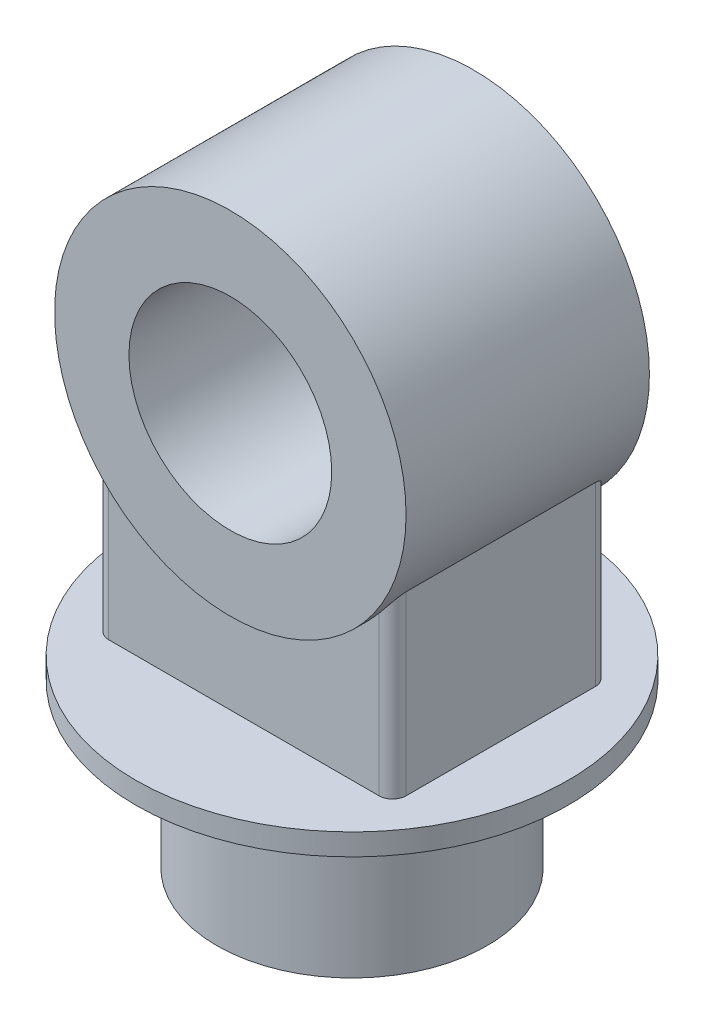
ISO-10303-21;
HEADER;
FILE_DESCRIPTION(('STEP AP214'),'2;1');
FILE_NAME('part.step','',(''),(''),'','','');
FILE_SCHEMA(('AUTOMOTIVE_DESIGN { 1 0 10303 214 1 1 1 1 }'));
ENDSEC;
DATA;
#1=APPLICATION_CONTEXT('core data for automotive mechanical design processes');
#2=APPLICATION_PROTOCOL_DEFINITION('international standard','automotive_design',2000,#1);
#3=PRODUCT_CONTEXT('',#1,'mechanical');
#4=PRODUCT('Part','Part','',(#3));
#5=PRODUCT_RELATED_PRODUCT_CATEGORY('part','',(#4));
#6=PRODUCT_DEFINITION_FORMATION('','',#4);
#7=PRODUCT_DEFINITION_CONTEXT('part definition',#1,'design');
#8=PRODUCT_DEFINITION('design','',#6,#7);
#9=PRODUCT_DEFINITION_SHAPE('','',#8);
#10=(LENGTH_UNIT() NAMED_UNIT(*) SI_UNIT(.MILLI.,.METRE.));
#11=(NAMED_UNIT(*) PLANE_ANGLE_UNIT() SI_UNIT($,.RADIAN.));
#12=(NAMED_UNIT(*) SI_UNIT($,.STERADIAN.) SOLID_ANGLE_UNIT());
#13=UNCERTAINTY_MEASURE_WITH_UNIT(LENGTH_MEASURE(1.E-05),#10,'distance_accuracy_value','');
#14=(GEOMETRIC_REPRESENTATION_CONTEXT(3) GLOBAL_UNCERTAINTY_ASSIGNED_CONTEXT((#13)) GLOBAL_UNIT_ASSIGNED_CONTEXT((#10,
#11,#12)) REPRESENTATION_CONTEXT('',''));
#15=CARTESIAN_POINT('',(0.,0.,0.));
#16=DIRECTION('',(0.,0.,1.));
#17=DIRECTION('',(1.,0.,0.));
#18=AXIS2_PLACEMENT_3D('',#15,#16,#17);
#19=CARTESIAN_POINT('',(0.,120.,0.));
#20=DIRECTION('',(0.,-1.,0.));
#21=DIRECTION('',(0.,0.,-1.));
#22=AXIS2_PLACEMENT_3D('',#19,#20,#21);
#23=CYLINDRICAL_SURFACE('',#22,100.);
#24=CARTESIAN_POINT('',(0.,120.,0.));
#25=DIRECTION('',(0.,1.,0.));
#26=DIRECTION('',(0.,0.,1.));
#27=AXIS2_PLACEMENT_3D('',#24,#25,#26);
#28=CIRCLE('',#27,100.);
#29=CARTESIAN_POINT('',(0.,120.,100.));
#30=VERTEX_POINT('',#29);
#31=EDGE_CURVE('E144',#30,#30,#28,.T.);
#32=ORIENTED_EDGE('',*,*,#31,.F.);
#33=EDGE_LOOP('',(#32));
#34=FACE_BOUND('',#33,.T.);
#35=CARTESIAN_POINT('',(0.,0.,0.));
#36=DIRECTION('',(0.,1.,0.));
#37=DIRECTION('',(0.,0.,1.));
#38=AXIS2_PLACEMENT_3D('',#35,#36,#37);
#39=CIRCLE('',#38,100.);
#40=CARTESIAN_POINT('',(0.,0.,100.));
#41=VERTEX_POINT('',#40);
#42=EDGE_CURVE('E218',#41,#41,#39,.T.);
#43=ORIENTED_EDGE('',*,*,#42,.T.);
#44=EDGE_LOOP('',(#43));
#45=FACE_BOUND('',#44,.T.);
#46=ADVANCED_FACE('F43',(#34,#45),#23,.T.);
#47=CARTESIAN_POINT('',(0.,0.,0.));
#48=DIRECTION('',(0.,1.,0.));
#49=DIRECTION('',(0.,0.,1.));
#50=AXIS2_PLACEMENT_3D('',#47,#48,#49);
#51=PLANE('',#50);
#52=ORIENTED_EDGE('',*,*,#42,.F.);
#53=EDGE_LOOP('',(#52));
#54=FACE_BOUND('',#53,.T.);
#55=ADVANCED_FACE('F206',(#54),#51,.F.);
#56=CARTESIAN_POINT('',(0.,136.,0.));
#57=DIRECTION('',(0.,-1.,0.));
#58=DIRECTION('',(0.,0.,-1.));
#59=AXIS2_PLACEMENT_3D('',#56,#57,#58);
#60=CYLINDRICAL_SURFACE('',#59,160.);
#61=CARTESIAN_POINT('',(0.,136.,0.));
#62=DIRECTION('',(0.,1.,0.));
#63=DIRECTION('',(0.,0.,1.));
#64=AXIS2_PLACEMENT_3D('',#61,#62,#63);
#65=CIRCLE('',#64,160.);
#66=CARTESIAN_POINT('',(0.,136.,160.));
#67=VERTEX_POINT('',#66);
#68=EDGE_CURVE('E219',#67,#67,#65,.T.);
#69=ORIENTED_EDGE('',*,*,#68,.F.);
#70=EDGE_LOOP('',(#69));
#71=FACE_BOUND('',#70,.T.);
#72=CARTESIAN_POINT('',(0.,120.,0.));
#73=DIRECTION('',(0.,1.,0.));
#74=DIRECTION('',(0.,0.,1.));
#75=AXIS2_PLACEMENT_3D('',#72,#73,#74);
#76=CIRCLE('',#75,160.);
#77=CARTESIAN_POINT('',(0.,120.,160.));
#78=VERTEX_POINT('',#77);
#79=EDGE_CURVE('E222',#78,#78,#76,.T.);
#80=ORIENTED_EDGE('',*,*,#79,.T.);
#81=EDGE_LOOP('',(#80));
#82=FACE_BOUND('',#81,.T.);
#83=ADVANCED_FACE('F211',(#71,#82),#60,.T.);
#84=CARTESIAN_POINT('',(0.,136.,0.));
#85=DIRECTION('',(0.,1.,0.));
#86=DIRECTION('',(0.,0.,1.));
#87=AXIS2_PLACEMENT_3D('',#84,#85,#86);
#88=PLANE('',#87);
#89=DIRECTION('',(0.,0.,-1.));
#90=VECTOR('',#89,1.);
#91=CARTESIAN_POINT('',(110.,136.,80.));
#92=LINE('',#91,#90);
#93=CARTESIAN_POINT('',(110.,136.,70.));
#94=VERTEX_POINT('',#93);
#95=CARTESIAN_POINT('',(110.,136.,-70.));
#96=VERTEX_POINT('',#95);
#97=EDGE_CURVE('E226',#94,#96,#92,.T.);
#98=ORIENTED_EDGE('',*,*,#97,.F.);
#99=CARTESIAN_POINT('',(100.,136.,70.));
#100=DIRECTION('',(0.,1.,0.));
#101=DIRECTION('',(0.,0.,1.));
#102=AXIS2_PLACEMENT_3D('',#99,#100,#101);
#103=CIRCLE('',#102,10.);
#104=CARTESIAN_POINT('',(100.,136.,80.));
#105=VERTEX_POINT('',#104);
#106=EDGE_CURVE('E126',#94,#105,#103,.F.);
#107=ORIENTED_EDGE('',*,*,#106,.T.);
#108=DIRECTION('',(1.,0.,0.));
#109=VECTOR('',#108,1.);
#110=CARTESIAN_POINT('',(-110.,136.,80.));
#111=LINE('',#110,#109);
#112=CARTESIAN_POINT('',(-100.,136.,80.));
#113=VERTEX_POINT('',#112);
#114=EDGE_CURVE('E231',#113,#105,#111,.T.);
#115=ORIENTED_EDGE('',*,*,#114,.F.);
#116=CARTESIAN_POINT('',(-100.,136.,70.));
#117=DIRECTION('',(0.,1.,0.));
#118=DIRECTION('',(0.,0.,1.));
#119=AXIS2_PLACEMENT_3D('',#116,#117,#118);
#120=CIRCLE('',#119,10.);
#121=CARTESIAN_POINT('',(-110.,136.,70.));
#122=VERTEX_POINT('',#121);
#123=EDGE_CURVE('E57',#113,#122,#120,.F.);
#124=ORIENTED_EDGE('',*,*,#123,.T.);
#125=DIRECTION('',(0.,0.,1.));
#126=VECTOR('',#125,1.);
#127=CARTESIAN_POINT('',(-110.,136.,80.));
#128=LINE('',#127,#126);
#129=CARTESIAN_POINT('',(-110.,136.,-70.));
#130=VERTEX_POINT('',#129);
#131=EDGE_CURVE('E234',#130,#122,#128,.T.);
#132=ORIENTED_EDGE('',*,*,#131,.F.);
#133=CARTESIAN_POINT('',(-100.,136.,-70.));
#134=DIRECTION('',(0.,1.,0.));
#135=DIRECTION('',(0.,0.,1.));
#136=AXIS2_PLACEMENT_3D('',#133,#134,#135);
#137=CIRCLE('',#136,10.);
#138=CARTESIAN_POINT('',(-100.,136.,-80.));
#139=VERTEX_POINT('',#138);
#140=EDGE_CURVE('E71',#130,#139,#137,.F.);
#141=ORIENTED_EDGE('',*,*,#140,.T.);
#142=DIRECTION('',(-1.,0.,0.));
#143=VECTOR('',#142,1.);
#144=CARTESIAN_POINT('',(-110.,136.,-80.));
#145=LINE('',#144,#143);
#146=CARTESIAN_POINT('',(100.,136.,-80.));
#147=VERTEX_POINT('',#146);
#148=EDGE_CURVE('E237',#147,#139,#145,.T.);
#149=ORIENTED_EDGE('',*,*,#148,.F.);
#150=CARTESIAN_POINT('',(100.,136.,-70.));
#151=DIRECTION('',(0.,1.,0.));
#152=DIRECTION('',(0.,0.,1.));
#153=AXIS2_PLACEMENT_3D('',#150,#151,#152);
#154=CIRCLE('',#153,10.);
#155=EDGE_CURVE('E127',#147,#96,#154,.F.);
#156=ORIENTED_EDGE('',*,*,#155,.T.);
#157=EDGE_LOOP('',(#98,#107,#115,#124,#132,#141,#149,#156));
#158=FACE_BOUND('',#157,.T.);
#159=ORIENTED_EDGE('',*,*,#68,.T.);
#160=EDGE_LOOP('',(#159));
#161=FACE_BOUND('',#160,.T.);
#162=ADVANCED_FACE('F277',(#158,#161),#88,.T.);
#163=CARTESIAN_POINT('',(0.,120.,0.));
#164=DIRECTION('',(0.,1.,0.));
#165=DIRECTION('',(0.,0.,1.));
#166=AXIS2_PLACEMENT_3D('',#163,#164,#165);
#167=PLANE('',#166);
#168=ORIENTED_EDGE('',*,*,#31,.T.);
#169=EDGE_LOOP('',(#168));
#170=FACE_BOUND('',#169,.T.);
#171=ORIENTED_EDGE('',*,*,#79,.F.);
#172=EDGE_LOOP('',(#171));
#173=FACE_BOUND('',#172,.T.);
#174=ADVANCED_FACE('F281',(#170,#173),#167,.F.);
#175=CARTESIAN_POINT('',(-110.,466.002,-80.));
#176=DIRECTION('',(0.,0.,1.));
#177=DIRECTION('',(1.,0.,0.));
#178=AXIS2_PLACEMENT_3D('',#175,#176,#177);
#179=PLANE('',#178);
#180=CARTESIAN_POINT('',(0.,336.,-80.));
#181=DIRECTION('',(0.,0.,1.));
#182=DIRECTION('',(1.,0.,0.));
#183=AXIS2_PLACEMENT_3D('',#180,#181,#182);
#184=CIRCLE('',#183,130.);
#185=CARTESIAN_POINT('',(100.,252.933761370819,-80.));
#186=VERTEX_POINT('',#185);
#187=CARTESIAN_POINT('',(-100.,252.933761370819,-80.));
#188=VERTEX_POINT('',#187);
#189=EDGE_CURVE('E119',#186,#188,#184,.F.);
#190=ORIENTED_EDGE('',*,*,#189,.F.);
#191=DIRECTION('',(0.,-1.,0.));
#192=VECTOR('',#191,1.);
#193=CARTESIAN_POINT('',(100.,466.002,-80.));
#194=LINE('',#193,#192);
#195=EDGE_CURVE('E133',#186,#147,#194,.T.);
#196=ORIENTED_EDGE('',*,*,#195,.T.);
#197=ORIENTED_EDGE('',*,*,#148,.T.);
#198=DIRECTION('',(0.,-1.,0.));
#199=VECTOR('',#198,1.);
#200=CARTESIAN_POINT('',(-100.,466.002,-80.));
#201=LINE('',#200,#199);
#202=EDGE_CURVE('E135',#139,#188,#201,.F.);
#203=ORIENTED_EDGE('',*,*,#202,.T.);
#204=EDGE_LOOP('',(#190,#196,#197,#203));
#205=FACE_BOUND('',#204,.T.);
#206=ADVANCED_FACE('F131',(#205),#179,.F.);
#207=CARTESIAN_POINT('',(110.,466.002,80.));
#208=DIRECTION('',(-1.,0.,0.));
#209=DIRECTION('',(0.,0.,1.));
#210=AXIS2_PLACEMENT_3D('',#207,#208,#209);
#211=PLANE('',#210);
#212=ORIENTED_EDGE('',*,*,#97,.T.);
#213=DIRECTION('',(0.,-1.,0.));
#214=VECTOR('',#213,1.);
#215=CARTESIAN_POINT('',(110.,466.002,-70.));
#216=LINE('',#215,#214);
#217=CARTESIAN_POINT('',(110.,266.717967697245,-70.));
#218=VERTEX_POINT('',#217);
#219=EDGE_CURVE('E142',#96,#218,#216,.F.);
#220=ORIENTED_EDGE('',*,*,#219,.T.);
#221=DIRECTION('',(0.,0.,-1.));
#222=VECTOR('',#221,1.);
#223=CARTESIAN_POINT('',(110.,266.717967697245,90.));
#224=LINE('',#223,#222);
#225=CARTESIAN_POINT('',(110.,266.717967697245,70.));
#226=VERTEX_POINT('',#225);
#227=EDGE_CURVE('E122',#226,#218,#224,.T.);
#228=ORIENTED_EDGE('',*,*,#227,.F.);
#229=DIRECTION('',(0.,-1.,0.));
#230=VECTOR('',#229,1.);
#231=CARTESIAN_POINT('',(110.,466.002,70.));
#232=LINE('',#231,#230);
#233=EDGE_CURVE('E139',#226,#94,#232,.T.);
#234=ORIENTED_EDGE('',*,*,#233,.T.);
#235=EDGE_LOOP('',(#212,#220,#228,#234));
#236=FACE_BOUND('',#235,.T.);
#237=ADVANCED_FACE('F289',(#236),#211,.F.);
#238=CARTESIAN_POINT('',(-110.,466.002,80.));
#239=DIRECTION('',(1.,0.,0.));
#240=DIRECTION('',(0.,0.,-1.));
#241=AXIS2_PLACEMENT_3D('',#238,#239,#240);
#242=PLANE('',#241);
#243=DIRECTION('',(0.,0.,-1.));
#244=VECTOR('',#243,1.);
#245=CARTESIAN_POINT('',(-110.,266.717967697245,90.));
#246=LINE('',#245,#244);
#247=CARTESIAN_POINT('',(-110.,266.717967697245,-70.));
#248=VERTEX_POINT('',#247);
#249=CARTESIAN_POINT('',(-110.,266.717967697245,70.));
#250=VERTEX_POINT('',#249);
#251=EDGE_CURVE('E136',#248,#250,#246,.F.);
#252=ORIENTED_EDGE('',*,*,#251,.F.);
#253=DIRECTION('',(0.,-1.,0.));
#254=VECTOR('',#253,1.);
#255=CARTESIAN_POINT('',(-110.,466.002,-70.));
#256=LINE('',#255,#254);
#257=EDGE_CURVE('E156',#248,#130,#256,.T.);
#258=ORIENTED_EDGE('',*,*,#257,.T.);
#259=ORIENTED_EDGE('',*,*,#131,.T.);
#260=DIRECTION('',(0.,-1.,0.));
#261=VECTOR('',#260,1.);
#262=CARTESIAN_POINT('',(-110.,466.002,70.));
#263=LINE('',#262,#261);
#264=EDGE_CURVE('E154',#122,#250,#263,.F.);
#265=ORIENTED_EDGE('',*,*,#264,.T.);
#266=EDGE_LOOP('',(#252,#258,#259,#265));
#267=FACE_BOUND('',#266,.T.);
#268=ADVANCED_FACE('F196',(#267),#242,.F.);
#269=CARTESIAN_POINT('',(-110.,466.002,80.));
#270=DIRECTION('',(0.,0.,-1.));
#271=DIRECTION('',(-1.,0.,0.));
#272=AXIS2_PLACEMENT_3D('',#269,#270,#271);
#273=PLANE('',#272);
#274=ORIENTED_EDGE('',*,*,#114,.T.);
#275=DIRECTION('',(0.,-1.,0.));
#276=VECTOR('',#275,1.);
#277=CARTESIAN_POINT('',(100.,466.002,80.));
#278=LINE('',#277,#276);
#279=CARTESIAN_POINT('',(100.,252.933761370819,80.));
#280=VERTEX_POINT('',#279);
#281=EDGE_CURVE('E152',#105,#280,#278,.F.);
#282=ORIENTED_EDGE('',*,*,#281,.T.);
#283=CARTESIAN_POINT('',(0.,336.,80.));
#284=DIRECTION('',(0.,0.,-1.));
#285=DIRECTION('',(-1.,0.,0.));
#286=AXIS2_PLACEMENT_3D('',#283,#284,#285);
#287=CIRCLE('',#286,130.);
#288=CARTESIAN_POINT('',(-100.,252.933761370819,80.));
#289=VERTEX_POINT('',#288);
#290=EDGE_CURVE('E198',#289,#280,#287,.F.);
#291=ORIENTED_EDGE('',*,*,#290,.F.);
#292=DIRECTION('',(0.,-1.,0.));
#293=VECTOR('',#292,1.);
#294=CARTESIAN_POINT('',(-100.,466.002,80.));
#295=LINE('',#294,#293);
#296=EDGE_CURVE('E149',#289,#113,#295,.T.);
#297=ORIENTED_EDGE('',*,*,#296,.T.);
#298=EDGE_LOOP('',(#274,#282,#291,#297));
#299=FACE_BOUND('',#298,.T.);
#300=ADVANCED_FACE('F265',(#299),#273,.F.);
#301=CARTESIAN_POINT('',(0.,336.,90.));
#302=DIRECTION('',(0.,0.,-1.));
#303=DIRECTION('',(-1.,0.,0.));
#304=AXIS2_PLACEMENT_3D('',#301,#302,#303);
#305=CYLINDRICAL_SURFACE('',#304,130.);
#306=CARTESIAN_POINT('',(0.,336.,90.));
#307=DIRECTION('',(0.,0.,1.));
#308=DIRECTION('',(1.,0.,0.));
#309=AXIS2_PLACEMENT_3D('',#306,#307,#308);
#310=CIRCLE('',#309,130.);
#311=CARTESIAN_POINT('',(130.,336.,90.));
#312=VERTEX_POINT('',#311);
#313=EDGE_CURVE('E228',#312,#312,#310,.T.);
#314=ORIENTED_EDGE('',*,*,#313,.F.);
#315=EDGE_LOOP('',(#314));
#316=FACE_BOUND('',#315,.T.);
#317=CARTESIAN_POINT('',(0.,336.,-90.));
#318=DIRECTION('',(0.,0.,1.));
#319=DIRECTION('',(1.,0.,0.));
#320=AXIS2_PLACEMENT_3D('',#317,#318,#319);
#321=CIRCLE('',#320,130.);
#322=CARTESIAN_POINT('',(130.,336.,-90.));
#323=VERTEX_POINT('',#322);
#324=EDGE_CURVE('E240',#323,#323,#321,.T.);
#325=ORIENTED_EDGE('',*,*,#324,.T.);
#326=EDGE_LOOP('',(#325));
#327=FACE_BOUND('',#326,.T.);
#328=ORIENTED_EDGE('',*,*,#290,.T.);
#329=CARTESIAN_POINT('',(100.,252.933761370819,80.));
#330=CARTESIAN_POINT('',(100.223611151915,253.202952503255,79.9999830665315));
#331=CARTESIAN_POINT('',(100.446118360057,253.473036166024,79.9924995885085));
#332=CARTESIAN_POINT('',(100.888548742496,254.014496760122,79.9629173131463));
#333=CARTESIAN_POINT('',(101.108472043759,254.285873626978,79.9408192370116));
#334=CARTESIAN_POINT('',(101.545586290072,254.829711400373,79.8822979337703));
#335=CARTESIAN_POINT('',(101.76277446753,255.102173087004,79.8458612385231));
#336=CARTESIAN_POINT('',(102.193849033468,255.647413797012,79.7588609087488));
#337=CARTESIAN_POINT('',(102.407735374993,255.920192824843,79.7082970735217));
#338=CARTESIAN_POINT('',(103.048408055095,256.74400885936,79.5343891784366));
#339=CARTESIAN_POINT('',(103.469748368072,257.294974230618,79.3894263280958));
#340=CARTESIAN_POINT('',(104.088382224678,258.117224843771,79.1288060997197));
#341=CARTESIAN_POINT('',(104.292337034927,258.39057162742,79.0347525474725));
#342=CARTESIAN_POINT('',(104.695498702643,258.935304765081,78.8319429710982));
#343=CARTESIAN_POINT('',(104.894706004332,259.206691300842,78.7231883289499));
#344=CARTESIAN_POINT('',(105.336170271764,259.812965668139,78.4620472638272));
#345=CARTESIAN_POINT('',(105.577006541077,260.147108038148,78.3055009036513));
#346=CARTESIAN_POINT('',(106.04966094987,260.809343252621,77.967808626391));
#347=CARTESIAN_POINT('',(106.281479043935,261.137436066616,77.7866625854444));
#348=CARTESIAN_POINT('',(106.734152264033,261.784259610706,77.3986376161628));
#349=CARTESIAN_POINT('',(106.955036134368,262.103013877598,77.1918317878757));
#350=CARTESIAN_POINT('',(107.384708325122,262.728803605627,76.749894392022));
#351=CARTESIAN_POINT('',(107.593501627276,263.035843875289,76.5147746155492));
#352=CARTESIAN_POINT('',(107.921279015409,263.522080966666,76.1068757916445));
#353=CARTESIAN_POINT('',(108.044709884718,263.706240813682,75.9435605188263));
#354=CARTESIAN_POINT('',(108.284949666933,264.066582834907,75.6038296157538));
#355=CARTESIAN_POINT('',(108.401760304956,264.242767084986,75.4274174262628));
#356=CARTESIAN_POINT('',(108.627683741988,264.585236991633,75.0605773993746));
#357=CARTESIAN_POINT('',(108.736797961361,264.751524473746,74.8701521613912));
#358=CARTESIAN_POINT('',(108.945874410432,265.071634412635,74.4745306992527));
#359=CARTESIAN_POINT('',(109.04583974995,265.225461102935,74.2693395369045));
#360=CARTESIAN_POINT('',(109.274660386151,265.579056080623,73.7536743100227));
#361=CARTESIAN_POINT('',(109.398046362816,265.771031349643,73.4351396850742));
#362=CARTESIAN_POINT('',(109.561336457207,266.026263049992,72.9345418523035));
#363=CARTESIAN_POINT('',(109.612072269395,266.105785634321,72.7641622498836));
#364=CARTESIAN_POINT('',(109.705421847597,266.25239837099,72.4160328323222));
#365=CARTESIAN_POINT('',(109.748040656091,266.319496241142,72.2382876769632));
#366=CARTESIAN_POINT('',(109.820262744001,266.433384610412,71.8947331689276));
#367=CARTESIAN_POINT('',(109.850752312767,266.481551609067,71.729567610939));
#368=CARTESIAN_POINT('',(109.903691363628,266.565274678987,71.3948451418076));
#369=CARTESIAN_POINT('',(109.926143541964,266.600834979285,71.2252897238033));
#370=CARTESIAN_POINT('',(109.962659042777,266.658707696818,70.8807814271977));
#371=CARTESIAN_POINT('',(109.976613864032,266.680848750137,70.7057875562757));
#372=CARTESIAN_POINT('',(109.99061964662,266.703076138542,70.4419386674803));
#373=CARTESIAN_POINT('',(109.99413386492,266.708654625171,70.3536902139711));
#374=CARTESIAN_POINT('',(109.998824989492,266.716102079045,70.1769662160102));
#375=CARTESIAN_POINT('',(110.000001659485,266.717970671296,70.088490649507));
#376=CARTESIAN_POINT('',(110.,266.717967697245,70.));
#377=B_SPLINE_CURVE_WITH_KNOTS('',3,(#329,#330,#331,#332,#333,#334,#335,#336,#337,#338,#339,
#340,#341,#342,#343,#344,#345,#346,#347,#348,#349,#350,#351,#352,#353,#354,#355,#356,#357,#358,
#359,#360,#361,#362,#363,#364,#365,#366,#367,#368,#369,#370,#371,#372,#373,#374,#375,#376),
.UNSPECIFIED.,.F.,.F.,(4,2,2,2,2,2,2,2,2,2,2,2,2,2,2,2,2,2,2,2,2,2,2,4),(0.,1.04974156507771,
2.09943133114567,3.15010942417265,4.20080244462031,6.32356278933855,7.38465211465322,
8.44564176134495,9.76677685539392,11.0879186017609,12.4053795382949,13.7222937149077,
14.5479419827463,15.3733741023698,16.1986534888326,17.023651302289,18.194686650492,
18.7783719827905,19.3616935243415,19.8852298594993,20.408590403038,20.9385006934629,
21.2038887699912,21.4693036704869),.UNSPECIFIED.);
#378=EDGE_CURVE('E180',#280,#226,#377,.T.);
#379=ORIENTED_EDGE('',*,*,#378,.T.);
#380=ORIENTED_EDGE('',*,*,#227,.T.);
#381=CARTESIAN_POINT('',(110.,266.717967697245,-70.));
#382=CARTESIAN_POINT('',(110.000033683462,266.718025852698,-70.1614230595313));
#383=CARTESIAN_POINT('',(109.996092792414,266.711764254296,-70.3228118197691));
#384=CARTESIAN_POINT('',(109.980519982779,266.687045880384,-70.6441123999957));
#385=CARTESIAN_POINT('',(109.968896213713,266.668602027069,-70.8040256031146));
#386=CARTESIAN_POINT('',(109.938376398954,266.620217986395,-71.1196424551221));
#387=CARTESIAN_POINT('',(109.919558261622,266.590400967593,-71.2753727040436));
#388=CARTESIAN_POINT('',(109.875071558334,266.52000006118,-71.5834085562726));
#389=CARTESIAN_POINT('',(109.849400846184,266.479412800404,-71.7357130704249));
#390=CARTESIAN_POINT('',(109.784772267017,266.377386983169,-72.0722520040974));
#391=CARTESIAN_POINT('',(109.744103525393,266.313281105856,-72.2553511890568));
#392=CARTESIAN_POINT('',(109.654040532803,266.17165023193,-72.6141464391851));
#393=CARTESIAN_POINT('',(109.604640075501,266.094115691273,-72.7898371277865));
#394=CARTESIAN_POINT('',(109.497968805892,265.927147418338,-73.1338723913451));
#395=CARTESIAN_POINT('',(109.440667457039,265.837667562915,-73.302184951541));
#396=CARTESIAN_POINT('',(109.319341126161,265.648779195145,-73.6304969218558));
#397=CARTESIAN_POINT('',(109.25531768694,265.549372961282,-73.7904982269664));
#398=CARTESIAN_POINT('',(109.085069343255,265.28590129292,-74.1868876463209));
#399=CARTESIAN_POINT('',(108.974781990569,265.115997241409,-74.4176642111939));
#400=CARTESIAN_POINT('',(108.742772943656,264.76058359918,-74.8607110351426));
#401=CARTESIAN_POINT('',(108.621044869784,264.575065307649,-75.072970840064));
#402=CARTESIAN_POINT('',(108.36794946479,264.19164129378,-75.4804206329535));
#403=CARTESIAN_POINT('',(108.236568322626,263.993717884812,-75.6755852518652));
#404=CARTESIAN_POINT('',(107.965814499919,263.588382733387,-76.0497203250662));
#405=CARTESIAN_POINT('',(107.826442440892,263.380971729107,-76.2286920360201));
#406=CARTESIAN_POINT('',(107.56145650763,262.989174407744,-76.5468161797372));
#407=CARTESIAN_POINT('',(107.436764821801,262.805791987749,-76.6879854690674));
#408=CARTESIAN_POINT('',(107.182869679799,262.434497987953,-76.9599552926783));
#409=CARTESIAN_POINT('',(107.053665586411,262.24658576965,-77.0907543539386));
#410=CARTESIAN_POINT('',(106.659844344167,261.677121003612,-77.4685356621902));
#411=CARTESIAN_POINT('',(106.389102445143,261.289965080353,-77.7008024816961));
#412=CARTESIAN_POINT('',(105.833418194947,260.504836154638,-78.129863631631));
#413=CARTESIAN_POINT('',(105.548442441802,260.106838810795,-78.3265689888296));
#414=CARTESIAN_POINT('',(104.96676628824,259.304344779382,-78.6860846955171));
#415=CARTESIAN_POINT('',(104.670068038633,258.899849292081,-78.8489012287858));
#416=CARTESIAN_POINT('',(104.024574509401,258.030646711215,-79.1623550419402));
#417=CARTESIAN_POINT('',(103.674248758637,257.565348460988,-79.3081944572228));
#418=CARTESIAN_POINT('',(102.961876677953,256.632523338709,-79.558756520093));
#419=CARTESIAN_POINT('',(102.599828734006,256.16499616738,-79.6634734792563));
#420=CARTESIAN_POINT('',(102.051092736822,255.466397204689,-79.7891645729387));
#421=CARTESIAN_POINT('',(101.868137468165,255.235094848973,-79.8257282191264));
#422=CARTESIAN_POINT('',(101.499966150616,254.77288550036,-79.8886289353229));
#423=CARTESIAN_POINT('',(101.314750133026,254.541978502041,-79.9149661467555));
#424=CARTESIAN_POINT('',(100.942320486513,254.080919722901,-79.9572665465168));
#425=CARTESIAN_POINT('',(100.755107350153,253.850767773367,-79.9732322353467));
#426=CARTESIAN_POINT('',(100.378860262163,253.391449185777,-79.9945948234744));
#427=CARTESIAN_POINT('',(100.189826234412,253.162282589497,-79.9999912789888));
#428=CARTESIAN_POINT('',(100.,252.933761370819,-80.));
#429=B_SPLINE_CURVE_WITH_KNOTS('',3,(#381,#382,#383,#384,#385,#386,#387,#388,#389,#390,#391,
#392,#393,#394,#395,#396,#397,#398,#399,#400,#401,#402,#403,#404,#405,#406,#407,#408,#409,#410,
#411,#412,#413,#414,#415,#416,#417,#418,#419,#420,#421,#422,#423,#424,#425,#426,#427,#428),
.UNSPECIFIED.,.F.,.F.,(4,2,2,2,2,2,2,2,2,2,2,2,2,2,2,2,2,2,2,2,2,2,2,4),(0.,0.484045005923069,
0.96757738914542,1.44601544684505,1.92460352520313,2.51835043890468,3.11252108624078,
3.7090561398874,4.30545457926274,5.22516595363375,6.14539326092329,7.06696382284192,
7.98846280401964,8.77680092000536,9.56525081419895,11.1426900482287,12.7240229357798,
14.305067020047,16.1047501551828,17.9046821508917,18.7960435003637,19.6873925225409,
20.5785265668947,21.4696980275819),.UNSPECIFIED.);
#430=EDGE_CURVE('E115',#218,#186,#429,.T.);
#431=ORIENTED_EDGE('',*,*,#430,.T.);
#432=ORIENTED_EDGE('',*,*,#189,.T.);
#433=CARTESIAN_POINT('',(-100.,252.933761370819,-80.));
#434=CARTESIAN_POINT('',(-100.223611151915,253.202952503255,-79.9999830665315));
#435=CARTESIAN_POINT('',(-100.446118360057,253.473036166024,-79.9924995885085));
#436=CARTESIAN_POINT('',(-100.888548742496,254.014496760122,-79.9629173131463));
#437=CARTESIAN_POINT('',(-101.10847204376,254.285873626978,-79.9408192370116));
#438=CARTESIAN_POINT('',(-101.545586290072,254.829711400373,-79.8822979337703));
#439=CARTESIAN_POINT('',(-101.76277446753,255.102173087004,-79.8458612385231));
#440=CARTESIAN_POINT('',(-102.193849033468,255.647413797012,-79.7588609087488));
#441=CARTESIAN_POINT('',(-102.407735374993,255.920192824843,-79.7082970735217));
#442=CARTESIAN_POINT('',(-103.048408055095,256.74400885936,-79.5343891784366));
#443=CARTESIAN_POINT('',(-103.469748368072,257.294974230618,-79.3894263280958));
#444=CARTESIAN_POINT('',(-104.088382224678,258.117224843771,-79.1288060997198));
#445=CARTESIAN_POINT('',(-104.292337034927,258.39057162742,-79.0347525474725));
#446=CARTESIAN_POINT('',(-104.695498702643,258.935304765081,-78.8319429710982));
#447=CARTESIAN_POINT('',(-104.894706004332,259.206691300842,-78.7231883289499));
#448=CARTESIAN_POINT('',(-105.336170271764,259.812965668139,-78.4620472638272));
#449=CARTESIAN_POINT('',(-105.577006541077,260.147108038148,-78.3055009036513));
#450=CARTESIAN_POINT('',(-106.049660949871,260.809343252621,-77.967808626391));
#451=CARTESIAN_POINT('',(-106.281479043935,261.137436066616,-77.7866625854443));
#452=CARTESIAN_POINT('',(-106.734152264033,261.784259610706,-77.3986376161628));
#453=CARTESIAN_POINT('',(-106.955036134368,262.103013877599,-77.1918317878757));
#454=CARTESIAN_POINT('',(-107.384708325122,262.728803605627,-76.749894392022));
#455=CARTESIAN_POINT('',(-107.593501627276,263.035843875289,-76.5147746155492));
#456=CARTESIAN_POINT('',(-107.921279015409,263.522080966667,-76.1068757916446));
#457=CARTESIAN_POINT('',(-108.044709884718,263.706240813683,-75.9435605188262));
#458=CARTESIAN_POINT('',(-108.284949666933,264.066582834907,-75.6038296157538));
#459=CARTESIAN_POINT('',(-108.401760304956,264.242767084987,-75.4274174262628));
#460=CARTESIAN_POINT('',(-108.627683741988,264.585236991633,-75.0605773993746));
#461=CARTESIAN_POINT('',(-108.736797961361,264.751524473746,-74.8701521613912));
#462=CARTESIAN_POINT('',(-108.945874410432,265.071634412635,-74.4745306992527));
#463=CARTESIAN_POINT('',(-109.04583974995,265.225461102935,-74.2693395369045));
#464=CARTESIAN_POINT('',(-109.274660386151,265.579056080623,-73.7536743100227));
#465=CARTESIAN_POINT('',(-109.398046362816,265.771031349643,-73.4351396850742));
#466=CARTESIAN_POINT('',(-109.561336457207,266.026263049993,-72.9345418523035));
#467=CARTESIAN_POINT('',(-109.612072269395,266.105785634321,-72.7641622498837));
#468=CARTESIAN_POINT('',(-109.705421847597,266.25239837099,-72.4160328323222));
#469=CARTESIAN_POINT('',(-109.748040656091,266.319496241142,-72.2382876769632));
#470=CARTESIAN_POINT('',(-109.820262744001,266.433384610412,-71.8947331689276));
#471=CARTESIAN_POINT('',(-109.850752312767,266.481551609067,-71.729567610939));
#472=CARTESIAN_POINT('',(-109.903691363628,266.565274678988,-71.3948451418076));
#473=CARTESIAN_POINT('',(-109.926143541964,266.600834979285,-71.2252897238033));
#474=CARTESIAN_POINT('',(-109.962659042777,266.658707696818,-70.8807814271977));
#475=CARTESIAN_POINT('',(-109.976613864032,266.680848750137,-70.7057875562757));
#476=CARTESIAN_POINT('',(-109.99061964662,266.703076138542,-70.4419386674803));
#477=CARTESIAN_POINT('',(-109.99413386492,266.708654625172,-70.3536902139711));
#478=CARTESIAN_POINT('',(-109.998824989492,266.716102079046,-70.1769662160103));
#479=CARTESIAN_POINT('',(-110.000001659485,266.717970671296,-70.088490649507));
#480=CARTESIAN_POINT('',(-110.,266.717967697245,-70.));
#481=B_SPLINE_CURVE_WITH_KNOTS('',3,(#433,#434,#435,#436,#437,#438,#439,#440,#441,#442,#443,
#444,#445,#446,#447,#448,#449,#450,#451,#452,#453,#454,#455,#456,#457,#458,#459,#460,#461,#462,
#463,#464,#465,#466,#467,#468,#469,#470,#471,#472,#473,#474,#475,#476,#477,#478,#479,#480),
.UNSPECIFIED.,.F.,.F.,(4,2,2,2,2,2,2,2,2,2,2,2,2,2,2,2,2,2,2,2,2,2,2,4),(0.,1.04974156507777,
2.09943133114573,3.15010942417272,4.20080244462032,6.32356278933861,7.38465211465328,
8.44564176134501,9.76677685539399,11.087918601761,12.4053795382949,13.7222937149078,
14.5479419827465,15.3733741023699,16.1986534888326,17.023651302289,18.194686650492,
18.7783719827905,19.3616935243416,19.8852298594993,20.4085904030381,20.9385006934629,
21.2038887699912,21.4693036704869),.UNSPECIFIED.);
#482=EDGE_CURVE('E187',#188,#248,#481,.T.);
#483=ORIENTED_EDGE('',*,*,#482,.T.);
#484=ORIENTED_EDGE('',*,*,#251,.T.);
#485=CARTESIAN_POINT('',(-110.,266.717967697245,70.));
#486=CARTESIAN_POINT('',(-110.000033683462,266.718025852698,70.1614230595313));
#487=CARTESIAN_POINT('',(-109.996092792414,266.711764254296,70.3228118197691));
#488=CARTESIAN_POINT('',(-109.980519982779,266.687045880384,70.6441123999957));
#489=CARTESIAN_POINT('',(-109.968896213713,266.668602027069,70.8040256031146));
#490=CARTESIAN_POINT('',(-109.938376398954,266.620217986395,71.1196424551221));
#491=CARTESIAN_POINT('',(-109.919558261622,266.590400967593,71.2753727040436));
#492=CARTESIAN_POINT('',(-109.875071558334,266.52000006118,71.5834085562726));
#493=CARTESIAN_POINT('',(-109.849400846184,266.479412800404,71.7357130704249));
#494=CARTESIAN_POINT('',(-109.784772267017,266.377386983169,72.0722520040974));
#495=CARTESIAN_POINT('',(-109.744103525393,266.313281105856,72.2553511890568));
#496=CARTESIAN_POINT('',(-109.654040532803,266.17165023193,72.6141464391851));
#497=CARTESIAN_POINT('',(-109.604640075501,266.094115691273,72.7898371277864));
#498=CARTESIAN_POINT('',(-109.497968805892,265.927147418338,73.133872391345));
#499=CARTESIAN_POINT('',(-109.440667457039,265.837667562915,73.302184951541));
#500=CARTESIAN_POINT('',(-109.319341126161,265.648779195145,73.6304969218558));
#501=CARTESIAN_POINT('',(-109.25531768694,265.549372961282,73.7904982269664));
#502=CARTESIAN_POINT('',(-109.085069343255,265.28590129292,74.1868876463209));
#503=CARTESIAN_POINT('',(-108.974781990569,265.115997241409,74.4176642111939));
#504=CARTESIAN_POINT('',(-108.742772943656,264.76058359918,74.8607110351426));
#505=CARTESIAN_POINT('',(-108.621044869784,264.575065307649,75.072970840064));
#506=CARTESIAN_POINT('',(-108.36794946479,264.19164129378,75.4804206329535));
#507=CARTESIAN_POINT('',(-108.236568322626,263.993717884812,75.6755852518652));
#508=CARTESIAN_POINT('',(-107.965814499919,263.588382733388,76.0497203250662));
#509=CARTESIAN_POINT('',(-107.826442440892,263.380971729107,76.2286920360201));
#510=CARTESIAN_POINT('',(-107.56145650763,262.989174407744,76.5468161797372));
#511=CARTESIAN_POINT('',(-107.436764821801,262.805791987749,76.6879854690674));
#512=CARTESIAN_POINT('',(-107.182869679799,262.434497987953,76.9599552926783));
#513=CARTESIAN_POINT('',(-107.053665586411,262.24658576965,77.0907543539386));
#514=CARTESIAN_POINT('',(-106.659844344167,261.677121003612,77.4685356621902));
#515=CARTESIAN_POINT('',(-106.389102445143,261.289965080353,77.7008024816961));
#516=CARTESIAN_POINT('',(-105.833418194947,260.504836154638,78.129863631631));
#517=CARTESIAN_POINT('',(-105.548442441802,260.106838810795,78.3265689888296));
#518=CARTESIAN_POINT('',(-104.96676628824,259.304344779382,78.6860846955171));
#519=CARTESIAN_POINT('',(-104.670068038633,258.899849292081,78.8489012287858));
#520=CARTESIAN_POINT('',(-104.024574509401,258.030646711215,79.1623550419402));
#521=CARTESIAN_POINT('',(-103.674248758637,257.565348460988,79.3081944572228));
#522=CARTESIAN_POINT('',(-102.961876677953,256.632523338709,79.558756520093));
#523=CARTESIAN_POINT('',(-102.599828734006,256.16499616738,79.6634734792563));
#524=CARTESIAN_POINT('',(-102.051092736822,255.466397204689,79.7891645729387));
#525=CARTESIAN_POINT('',(-101.868137468165,255.235094848973,79.8257282191264));
#526=CARTESIAN_POINT('',(-101.499966150616,254.77288550036,79.8886289353229));
#527=CARTESIAN_POINT('',(-101.314750133026,254.541978502041,79.9149661467555));
#528=CARTESIAN_POINT('',(-100.942320486513,254.080919722901,79.9572665465168));
#529=CARTESIAN_POINT('',(-100.755107350153,253.850767773367,79.9732322353467));
#530=CARTESIAN_POINT('',(-100.378860262163,253.391449185777,79.9945948234744));
#531=CARTESIAN_POINT('',(-100.189826234412,253.162282589497,79.9999912789888));
#532=CARTESIAN_POINT('',(-100.,252.933761370819,80.));
#533=B_SPLINE_CURVE_WITH_KNOTS('',3,(#485,#486,#487,#488,#489,#490,#491,#492,#493,#494,#495,
#496,#497,#498,#499,#500,#501,#502,#503,#504,#505,#506,#507,#508,#509,#510,#511,#512,#513,#514,
#515,#516,#517,#518,#519,#520,#521,#522,#523,#524,#525,#526,#527,#528,#529,#530,#531,#532),
.UNSPECIFIED.,.F.,.F.,(4,2,2,2,2,2,2,2,2,2,2,2,2,2,2,2,2,2,2,2,2,2,2,4),(0.,0.48404500592307,
0.967577389145413,1.44601544684505,1.92460352520314,2.51835043890465,3.11252108624073,
3.7090561398874,4.30545457926274,5.22516595363374,6.14539326092327,7.06696382284195,
7.98846280401965,8.77680092000544,9.56525081419897,11.1426900482286,12.7240229357798,
14.305067020047,16.1047501551828,17.9046821508917,18.7960435003638,19.687392522541,
20.5785265668948,21.4696980275819),.UNSPECIFIED.);
#534=EDGE_CURVE('E12',#250,#289,#533,.T.);
#535=ORIENTED_EDGE('',*,*,#534,.T.);
#536=EDGE_LOOP('',(#328,#379,#380,#431,#432,#483,#484,#535));
#537=FACE_BOUND('',#536,.T.);
#538=ADVANCED_FACE('F118',(#316,#327,#537),#305,.T.);
#539=CARTESIAN_POINT('',(0.,336.,90.));
#540=DIRECTION('',(0.,0.,1.));
#541=DIRECTION('',(1.,0.,0.));
#542=AXIS2_PLACEMENT_3D('',#539,#540,#541);
#543=PLANE('',#542);
#544=ORIENTED_EDGE('',*,*,#313,.T.);
#545=EDGE_LOOP('',(#544));
#546=FACE_BOUND('',#545,.T.);
#547=CARTESIAN_POINT('',(0.,336.,90.));
#548=DIRECTION('',(0.,0.,1.));
#549=DIRECTION('',(1.,0.,0.));
#550=AXIS2_PLACEMENT_3D('',#547,#548,#549);
#551=CIRCLE('',#550,75.);
#552=CARTESIAN_POINT('',(-75.,336.,90.));
#553=VERTEX_POINT('',#552);
#554=EDGE_CURVE('E243',#553,#553,#551,.T.);
#555=ORIENTED_EDGE('',*,*,#554,.F.);
#556=EDGE_LOOP('',(#555));
#557=FACE_BOUND('',#556,.T.);
#558=ADVANCED_FACE('F254',(#546,#557),#543,.T.);
#559=CARTESIAN_POINT('',(0.,336.,-90.));
#560=DIRECTION('',(0.,0.,1.));
#561=DIRECTION('',(1.,0.,0.));
#562=AXIS2_PLACEMENT_3D('',#559,#560,#561);
#563=PLANE('',#562);
#564=ORIENTED_EDGE('',*,*,#324,.F.);
#565=EDGE_LOOP('',(#564));
#566=FACE_BOUND('',#565,.T.);
#567=CARTESIAN_POINT('',(0.,336.,-90.));
#568=DIRECTION('',(0.,0.,1.));
#569=DIRECTION('',(1.,0.,0.));
#570=AXIS2_PLACEMENT_3D('',#567,#568,#569);
#571=CIRCLE('',#570,75.);
#572=CARTESIAN_POINT('',(-75.,336.,-90.));
#573=VERTEX_POINT('',#572);
#574=EDGE_CURVE('E246',#573,#573,#571,.T.);
#575=ORIENTED_EDGE('',*,*,#574,.T.);
#576=EDGE_LOOP('',(#575));
#577=FACE_BOUND('',#576,.T.);
#578=ADVANCED_FACE('F256',(#566,#577),#563,.F.);
#579=CARTESIAN_POINT('',(0.,336.,90.));
#580=DIRECTION('',(0.,0.,-1.));
#581=DIRECTION('',(-1.,0.,0.));
#582=AXIS2_PLACEMENT_3D('',#579,#580,#581);
#583=CYLINDRICAL_SURFACE('',#582,75.);
#584=CARTESIAN_POINT('',(-75.,336.,90.));
#585=CARTESIAN_POINT('',(-75.,336.,88.125));
#586=CARTESIAN_POINT('',(-75.,336.,86.25));
#587=CARTESIAN_POINT('',(-75.,336.,82.5));
#588=CARTESIAN_POINT('',(-75.,336.,80.625));
#589=CARTESIAN_POINT('',(-75.,336.,76.875));
#590=CARTESIAN_POINT('',(-75.,336.,75.));
#591=CARTESIAN_POINT('',(-75.,336.,71.25));
#592=CARTESIAN_POINT('',(-75.,336.,69.375));
#593=CARTESIAN_POINT('',(-75.,336.,65.625));
#594=CARTESIAN_POINT('',(-75.,336.,63.75));
#595=CARTESIAN_POINT('',(-75.,336.,60.));
#596=CARTESIAN_POINT('',(-75.,336.,58.125));
#597=CARTESIAN_POINT('',(-75.,336.,54.375));
#598=CARTESIAN_POINT('',(-75.,336.,52.5));
#599=CARTESIAN_POINT('',(-75.,336.,48.75));
#600=CARTESIAN_POINT('',(-75.,336.,46.875));
#601=CARTESIAN_POINT('',(-75.,336.,43.125));
#602=CARTESIAN_POINT('',(-75.,336.,41.25));
#603=CARTESIAN_POINT('',(-75.,336.,37.5));
#604=CARTESIAN_POINT('',(-75.,336.,35.625));
#605=CARTESIAN_POINT('',(-75.,336.,31.875));
#606=CARTESIAN_POINT('',(-75.,336.,30.));
#607=CARTESIAN_POINT('',(-75.,336.,26.25));
#608=CARTESIAN_POINT('',(-75.,336.,24.375));
#609=CARTESIAN_POINT('',(-75.,336.,20.625));
#610=CARTESIAN_POINT('',(-75.,336.,18.75));
#611=CARTESIAN_POINT('',(-75.,336.,15.));
#612=CARTESIAN_POINT('',(-75.,336.,13.125));
#613=CARTESIAN_POINT('',(-75.,336.,9.37499999999998));
#614=CARTESIAN_POINT('',(-75.,336.,7.49999999999998));
#615=CARTESIAN_POINT('',(-75.,336.,3.74999999999998));
#616=CARTESIAN_POINT('',(-75.,336.,1.87499999999997));
#617=CARTESIAN_POINT('',(-75.,336.,-1.87500000000003));
#618=CARTESIAN_POINT('',(-75.,336.,-3.75000000000003));
#619=CARTESIAN_POINT('',(-75.,336.,-7.50000000000003));
#620=CARTESIAN_POINT('',(-75.,336.,-9.37500000000004));
#621=CARTESIAN_POINT('',(-75.,336.,-13.125));
#622=CARTESIAN_POINT('',(-75.,336.,-15.));
#623=CARTESIAN_POINT('',(-75.,336.,-18.75));
#624=CARTESIAN_POINT('',(-75.,336.,-20.625));
#625=CARTESIAN_POINT('',(-75.,336.,-24.375));
#626=CARTESIAN_POINT('',(-75.,336.,-26.25));
#627=CARTESIAN_POINT('',(-75.,336.,-30.));
#628=CARTESIAN_POINT('',(-75.,336.,-31.875));
#629=CARTESIAN_POINT('',(-75.,336.,-35.625));
#630=CARTESIAN_POINT('',(-75.,336.,-37.5));
#631=CARTESIAN_POINT('',(-75.,336.,-41.25));
#632=CARTESIAN_POINT('',(-75.,336.,-43.125));
#633=CARTESIAN_POINT('',(-75.,336.,-46.875));
#634=CARTESIAN_POINT('',(-75.,336.,-48.75));
#635=CARTESIAN_POINT('',(-75.,336.,-52.5));
#636=CARTESIAN_POINT('',(-75.,336.,-54.375));
#637=CARTESIAN_POINT('',(-75.,336.,-58.125));
#638=CARTESIAN_POINT('',(-75.,336.,-60.));
#639=CARTESIAN_POINT('',(-75.,336.,-63.75));
#640=CARTESIAN_POINT('',(-75.,336.,-65.625));
#641=CARTESIAN_POINT('',(-75.,336.,-69.375));
#642=CARTESIAN_POINT('',(-75.,336.,-71.25));
#643=CARTESIAN_POINT('',(-75.,336.,-75.));
#644=CARTESIAN_POINT('',(-75.,336.,-76.875));
#645=CARTESIAN_POINT('',(-75.,336.,-80.625));
#646=CARTESIAN_POINT('',(-75.,336.,-82.5));
#647=CARTESIAN_POINT('',(-75.,336.,-86.25));
#648=CARTESIAN_POINT('',(-75.,336.,-88.125));
#649=CARTESIAN_POINT('',(-75.,336.,-90.));
#650=B_SPLINE_CURVE_WITH_KNOTS('',3,(#584,#585,#586,#587,#588,#589,#590,#591,#592,#593,#594,
#595,#596,#597,#598,#599,#600,#601,#602,#603,#604,#605,#606,#607,#608,#609,#610,#611,#612,#613,
#614,#615,#616,#617,#618,#619,#620,#621,#622,#623,#624,#625,#626,#627,#628,#629,#630,#631,#632,
#633,#634,#635,#636,#637,#638,#639,#640,#641,#642,#643,#644,#645,#646,#647,#648,#649),
.UNSPECIFIED.,.F.,.F.,(4,2,2,2,2,2,2,2,2,2,2,2,2,2,2,2,2,2,2,2,2,2,2,2,2,2,2,2,2,2,2,2,4),(0.,
5.62499999999999,11.25,16.875,22.5,28.125,33.75,39.375,45.,50.625,56.25,61.875,67.5,73.125,
78.75,84.375,90.,95.625,101.25,106.875,112.5,118.125,123.75,129.375,135.,140.625,146.25,151.875,
157.5,163.125,168.75,174.375,180.),.UNSPECIFIED.);
#651=EDGE_CURVE('BSEAM173',#553,#573,#650,.T.);
#652=ORIENTED_EDGE('',*,*,#554,.T.);
#653=ORIENTED_EDGE('',*,*,#574,.F.);
#654=ORIENTED_EDGE('',*,*,#651,.T.);
#655=ORIENTED_EDGE('',*,*,#651,.F.);
#656=EDGE_LOOP('',(#652,#654,#653,#655));
#657=FACE_BOUND('',#656,.T.);
#658=ADVANCED_FACE('F173',(#657),#583,.F.);
#659=CARTESIAN_POINT('',(100.,466.002,-70.));
#660=DIRECTION('',(0.,-1.,0.));
#661=DIRECTION('',(0.,0.,-1.));
#662=AXIS2_PLACEMENT_3D('',#659,#660,#661);
#663=CYLINDRICAL_SURFACE('',#662,10.);
#664=ORIENTED_EDGE('',*,*,#430,.F.);
#665=ORIENTED_EDGE('',*,*,#219,.F.);
#666=ORIENTED_EDGE('',*,*,#155,.F.);
#667=ORIENTED_EDGE('',*,*,#195,.F.);
#668=EDGE_LOOP('',(#664,#665,#666,#667));
#669=FACE_BOUND('',#668,.T.);
#670=ADVANCED_FACE('F138',(#669),#663,.T.);
#671=CARTESIAN_POINT('',(100.,466.002,70.));
#672=DIRECTION('',(0.,-1.,0.));
#673=DIRECTION('',(0.,0.,-1.));
#674=AXIS2_PLACEMENT_3D('',#671,#672,#673);
#675=CYLINDRICAL_SURFACE('',#674,10.);
#676=ORIENTED_EDGE('',*,*,#378,.F.);
#677=ORIENTED_EDGE('',*,*,#281,.F.);
#678=ORIENTED_EDGE('',*,*,#106,.F.);
#679=ORIENTED_EDGE('',*,*,#233,.F.);
#680=EDGE_LOOP('',(#676,#677,#678,#679));
#681=FACE_BOUND('',#680,.T.);
#682=ADVANCED_FACE('F172',(#681),#675,.T.);
#683=CARTESIAN_POINT('',(-100.,466.002,-70.));
#684=DIRECTION('',(0.,-1.,0.));
#685=DIRECTION('',(0.,0.,-1.));
#686=AXIS2_PLACEMENT_3D('',#683,#684,#685);
#687=CYLINDRICAL_SURFACE('',#686,10.);
#688=ORIENTED_EDGE('',*,*,#482,.F.);
#689=ORIENTED_EDGE('',*,*,#202,.F.);
#690=ORIENTED_EDGE('',*,*,#140,.F.);
#691=ORIENTED_EDGE('',*,*,#257,.F.);
#692=EDGE_LOOP('',(#688,#689,#690,#691));
#693=FACE_BOUND('',#692,.T.);
#694=ADVANCED_FACE('F177',(#693),#687,.T.);
#695=CARTESIAN_POINT('',(-100.,466.002,70.));
#696=DIRECTION('',(0.,-1.,0.));
#697=DIRECTION('',(0.,0.,-1.));
#698=AXIS2_PLACEMENT_3D('',#695,#696,#697);
#699=CYLINDRICAL_SURFACE('',#698,10.);
#700=ORIENTED_EDGE('',*,*,#534,.F.);
#701=ORIENTED_EDGE('',*,*,#264,.F.);
#702=ORIENTED_EDGE('',*,*,#123,.F.);
#703=ORIENTED_EDGE('',*,*,#296,.F.);
#704=EDGE_LOOP('',(#700,#701,#702,#703));
#705=FACE_BOUND('',#704,.T.);
#706=ADVANCED_FACE('F45',(#705),#699,.T.);
#707=CLOSED_SHELL('',(#46,#55,#83,#162,#174,#206,#237,#268,#300,#538,#558,#578,#658,#670,#682,
#694,#706));
#708=MANIFOLD_SOLID_BREP('B2',#707);
#709=ADVANCED_BREP_SHAPE_REPRESENTATION('',(#18,#708),#14);
#710=SHAPE_DEFINITION_REPRESENTATION(#9,#709);
ENDSEC;
END-ISO-10303-21;
